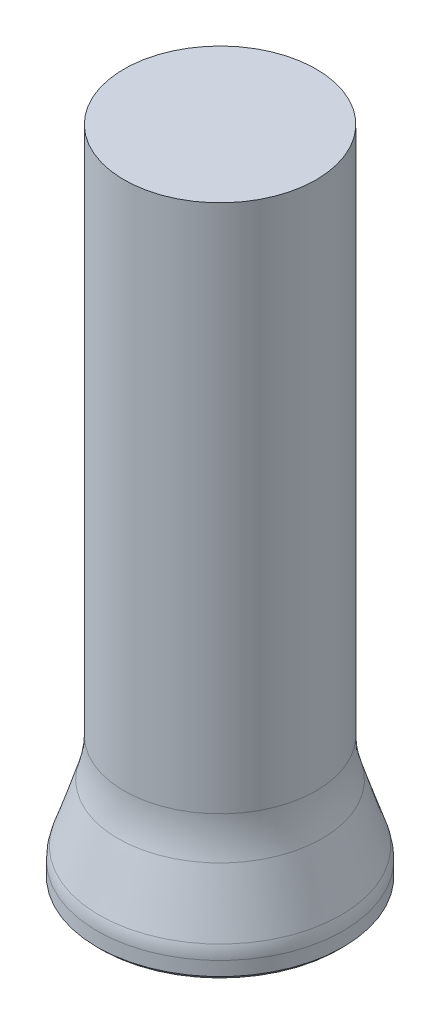
ISO-10303-21;
HEADER;
FILE_DESCRIPTION(('STEP AP214'),'2;1');
FILE_NAME('part.step','',(''),(''),'','','');
FILE_SCHEMA(('AUTOMOTIVE_DESIGN { 1 0 10303 214 1 1 1 1 }'));
ENDSEC;
DATA;
#1=APPLICATION_CONTEXT('core data for automotive mechanical design processes');
#2=APPLICATION_PROTOCOL_DEFINITION('international standard','automotive_design',2000,#1);
#3=PRODUCT_CONTEXT('',#1,'mechanical');
#4=PRODUCT('Part','Part','',(#3));
#5=PRODUCT_RELATED_PRODUCT_CATEGORY('part','',(#4));
#6=PRODUCT_DEFINITION_FORMATION('','',#4);
#7=PRODUCT_DEFINITION_CONTEXT('part definition',#1,'design');
#8=PRODUCT_DEFINITION('design','',#6,#7);
#9=PRODUCT_DEFINITION_SHAPE('','',#8);
#10=(LENGTH_UNIT() NAMED_UNIT(*) SI_UNIT(.MILLI.,.METRE.));
#11=(NAMED_UNIT(*) PLANE_ANGLE_UNIT() SI_UNIT($,.RADIAN.));
#12=(NAMED_UNIT(*) SI_UNIT($,.STERADIAN.) SOLID_ANGLE_UNIT());
#13=UNCERTAINTY_MEASURE_WITH_UNIT(LENGTH_MEASURE(1.E-05),#10,'distance_accuracy_value','');
#14=(GEOMETRIC_REPRESENTATION_CONTEXT(3) GLOBAL_UNCERTAINTY_ASSIGNED_CONTEXT((#13)) GLOBAL_UNIT_ASSIGNED_CONTEXT((#10,
#11,#12)) REPRESENTATION_CONTEXT('',''));
#15=CARTESIAN_POINT('',(0.,0.,0.));
#16=DIRECTION('',(0.,0.,1.));
#17=DIRECTION('',(1.,0.,0.));
#18=AXIS2_PLACEMENT_3D('',#15,#16,#17);
#19=CARTESIAN_POINT('',(0.,-45.9285357737105,0.));
#20=DIRECTION('',(0.,1.,0.));
#21=DIRECTION('',(-1.,0.,0.));
#22=AXIS2_PLACEMENT_3D('',#19,#20,#21);
#23=PLANE('',#22);
#24=CARTESIAN_POINT('',(0.,-45.9285357737105,0.));
#25=DIRECTION('',(0.,-1.,0.));
#26=DIRECTION('',(1.,0.,0.));
#27=AXIS2_PLACEMENT_3D('',#24,#25,#26);
#28=CIRCLE('',#27,5.);
#29=CARTESIAN_POINT('',(5.00000000000002,-45.9285357737105,0.));
#30=VERTEX_POINT('',#29);
#31=EDGE_CURVE('E52',#30,#30,#28,.T.);
#32=ORIENTED_EDGE('',*,*,#31,.T.);
#33=EDGE_LOOP('',(#32));
#34=FACE_BOUND('',#33,.T.);
#35=ADVANCED_FACE('F32',(#34),#23,.F.);
#36=CARTESIAN_POINT('',(0.,-45.9285357737105,0.));
#37=DIRECTION('',(0.,-1.,0.));
#38=DIRECTION('',(1.,0.,0.));
#39=AXIS2_PLACEMENT_3D('',#36,#37,#38);
#40=CYLINDRICAL_SURFACE('',#39,5.);
#41=CARTESIAN_POINT('',(0.,-47.9285357737105,0.));
#42=DIRECTION('',(0.,1.,0.));
#43=DIRECTION('',(-1.,0.,0.));
#44=AXIS2_PLACEMENT_3D('',#41,#42,#43);
#45=CIRCLE('',#44,5.);
#46=CARTESIAN_POINT('',(-4.99999999999998,-47.9285357737105,0.));
#47=VERTEX_POINT('',#46);
#48=EDGE_CURVE('E10',#47,#47,#45,.F.);
#49=ORIENTED_EDGE('',*,*,#48,.T.);
#50=EDGE_LOOP('',(#49));
#51=FACE_BOUND('',#50,.T.);
#52=ORIENTED_EDGE('',*,*,#31,.F.);
#53=EDGE_LOOP('',(#52));
#54=FACE_BOUND('',#53,.T.);
#55=ADVANCED_FACE('F86',(#51,#54),#40,.F.);
#56=CARTESIAN_POINT('',(-30.,-48.9285357737105,0.));
#57=DIRECTION('',(0.,1.,0.));
#58=DIRECTION('',(-1.,0.,0.));
#59=AXIS2_PLACEMENT_3D('',#56,#57,#58);
#60=PLANE('',#59);
#61=CARTESIAN_POINT('',(0.,-48.9285357737105,0.));
#62=DIRECTION('',(0.,1.,0.));
#63=DIRECTION('',(-1.,0.,0.));
#64=AXIS2_PLACEMENT_3D('',#61,#62,#63);
#65=CIRCLE('',#64,29.);
#66=CARTESIAN_POINT('',(-29.,-48.9285357737105,0.));
#67=VERTEX_POINT('',#66);
#68=EDGE_CURVE('E43',#67,#67,#65,.F.);
#69=ORIENTED_EDGE('',*,*,#68,.T.);
#70=EDGE_LOOP('',(#69));
#71=FACE_BOUND('',#70,.T.);
#72=CARTESIAN_POINT('',(0.,-48.9285357737105,0.));
#73=DIRECTION('',(0.,1.,0.));
#74=DIRECTION('',(-1.,0.,0.));
#75=AXIS2_PLACEMENT_3D('',#72,#73,#74);
#76=CIRCLE('',#75,6.00000000000001);
#77=CARTESIAN_POINT('',(-5.99999999999999,-48.9285357737105,0.));
#78=VERTEX_POINT('',#77);
#79=EDGE_CURVE('E47',#78,#78,#76,.T.);
#80=ORIENTED_EDGE('',*,*,#79,.T.);
#81=EDGE_LOOP('',(#80));
#82=FACE_BOUND('',#81,.T.);
#83=ADVANCED_FACE('F92',(#71,#82),#60,.F.);
#84=CARTESIAN_POINT('',(0.,-45.9285357737105,0.));
#85=DIRECTION('',(0.,-1.,0.));
#86=DIRECTION('',(1.,0.,0.));
#87=AXIS2_PLACEMENT_3D('',#84,#85,#86);
#88=CYLINDRICAL_SURFACE('',#87,30.);
#89=CARTESIAN_POINT('',(0.,-47.9285357737105,0.));
#90=DIRECTION('',(0.,1.,0.));
#91=DIRECTION('',(-1.,0.,0.));
#92=AXIS2_PLACEMENT_3D('',#89,#90,#91);
#93=CIRCLE('',#92,30.);
#94=CARTESIAN_POINT('',(-30.,-47.9285357737105,0.));
#95=VERTEX_POINT('',#94);
#96=EDGE_CURVE('E39',#95,#95,#93,.T.);
#97=ORIENTED_EDGE('',*,*,#96,.T.);
#98=EDGE_LOOP('',(#97));
#99=FACE_BOUND('',#98,.T.);
#100=CARTESIAN_POINT('',(0.,-44.5243355752286,0.));
#101=DIRECTION('',(0.,-1.,0.));
#102=DIRECTION('',(1.,0.,0.));
#103=AXIS2_PLACEMENT_3D('',#100,#101,#102);
#104=CIRCLE('',#103,30.);
#105=CARTESIAN_POINT('',(30.,-44.5243355752286,0.));
#106=VERTEX_POINT('',#105);
#107=EDGE_CURVE('E55',#106,#106,#104,.T.);
#108=ORIENTED_EDGE('',*,*,#107,.T.);
#109=EDGE_LOOP('',(#108));
#110=FACE_BOUND('',#109,.T.);
#111=ADVANCED_FACE('F97',(#99,#110),#88,.T.);
#112=CARTESIAN_POINT('',(0.,-44.5243355752286,0.));
#113=DIRECTION('',(0.,-1.,0.));
#114=DIRECTION('',(1.,0.,0.));
#115=AXIS2_PLACEMENT_3D('',#112,#113,#114);
#116=TOROIDAL_SURFACE('',#115,20.,10.);
#117=ORIENTED_EDGE('',*,*,#107,.F.);
#118=EDGE_LOOP('',(#117));
#119=FACE_BOUND('',#118,.T.);
#120=CARTESIAN_POINT('',(0.,-41.4119941434583,0.));
#121=DIRECTION('',(0.,-1.,0.));
#122=DIRECTION('',(1.,0.,0.));
#123=AXIS2_PLACEMENT_3D('',#120,#121,#122);
#124=CIRCLE('',#123,29.5033326160924);
#125=CARTESIAN_POINT('',(29.5033326160924,-41.4119941434583,0.));
#126=VERTEX_POINT('',#125);
#127=EDGE_CURVE('E58',#126,#126,#124,.T.);
#128=ORIENTED_EDGE('',*,*,#127,.T.);
#129=EDGE_LOOP('',(#128));
#130=FACE_BOUND('',#129,.T.);
#131=ADVANCED_FACE('F101',(#119,#130),#116,.T.);
#132=CARTESIAN_POINT('',(0.,-27.4781606644669,0.));
#133=DIRECTION('',(0.,-1.,0.));
#134=DIRECTION('',(1.,0.,0.));
#135=AXIS2_PLACEMENT_3D('',#132,#133,#134);
#136=CONICAL_SURFACE('',#135,24.9400021517227,0.316491399278022);
#137=ORIENTED_EDGE('',*,*,#127,.F.);
#138=EDGE_LOOP('',(#137));
#139=FACE_BOUND('',#138,.T.);
#140=CARTESIAN_POINT('',(0.,-27.4781606644669,0.));
#141=DIRECTION('',(0.,-1.,0.));
#142=DIRECTION('',(1.,0.,0.));
#143=AXIS2_PLACEMENT_3D('',#140,#141,#142);
#144=CIRCLE('',#143,24.9400021517227);
#145=CARTESIAN_POINT('',(24.9400021517227,-27.4781606644669,0.));
#146=VERTEX_POINT('',#145);
#147=EDGE_CURVE('E61',#146,#146,#144,.T.);
#148=ORIENTED_EDGE('',*,*,#147,.T.);
#149=EDGE_LOOP('',(#148));
#150=FACE_BOUND('',#149,.T.);
#151=ADVANCED_FACE('F104',(#139,#150),#136,.T.);
#152=CARTESIAN_POINT('',(0.,-18.141136369156,0.));
#153=DIRECTION('',(0.,-1.,0.));
#154=DIRECTION('',(1.,0.,0.));
#155=AXIS2_PLACEMENT_3D('',#152,#153,#154);
#156=TOROIDAL_SURFACE('',#155,53.45,30.);
#157=ORIENTED_EDGE('',*,*,#147,.F.);
#158=EDGE_LOOP('',(#157));
#159=FACE_BOUND('',#158,.T.);
#160=CARTESIAN_POINT('',(0.,-18.1411363691559,0.));
#161=DIRECTION('',(0.,-1.,0.));
#162=DIRECTION('',(1.,0.,0.));
#163=AXIS2_PLACEMENT_3D('',#160,#161,#162);
#164=CIRCLE('',#163,23.45);
#165=CARTESIAN_POINT('',(23.45,-18.1411363691559,0.));
#166=VERTEX_POINT('',#165);
#167=EDGE_CURVE('E64',#166,#166,#164,.T.);
#168=ORIENTED_EDGE('',*,*,#167,.T.);
#169=EDGE_LOOP('',(#168));
#170=FACE_BOUND('',#169,.T.);
#171=ADVANCED_FACE('F82',(#159,#170),#156,.F.);
#172=CARTESIAN_POINT('',(0.,-45.9285357737105,0.));
#173=DIRECTION('',(0.,-1.,0.));
#174=DIRECTION('',(1.,0.,0.));
#175=AXIS2_PLACEMENT_3D('',#172,#173,#174);
#176=CYLINDRICAL_SURFACE('',#175,23.45);
#177=ORIENTED_EDGE('',*,*,#167,.F.);
#178=EDGE_LOOP('',(#177));
#179=FACE_BOUND('',#178,.T.);
#180=CARTESIAN_POINT('',(0.,111.07146422629,0.));
#181=DIRECTION('',(0.,-1.,0.));
#182=DIRECTION('',(1.,0.,0.));
#183=AXIS2_PLACEMENT_3D('',#180,#181,#182);
#184=CIRCLE('',#183,23.45);
#185=CARTESIAN_POINT('',(23.45,111.07146422629,0.));
#186=VERTEX_POINT('',#185);
#187=EDGE_CURVE('E67',#186,#186,#184,.T.);
#188=ORIENTED_EDGE('',*,*,#187,.T.);
#189=EDGE_LOOP('',(#188));
#190=FACE_BOUND('',#189,.T.);
#191=ADVANCED_FACE('F71',(#179,#190),#176,.T.);
#192=CARTESIAN_POINT('',(0.,111.07146422629,0.));
#193=DIRECTION('',(0.,-1.,0.));
#194=DIRECTION('',(1.,0.,0.));
#195=AXIS2_PLACEMENT_3D('',#192,#193,#194);
#196=PLANE('',#195);
#197=ORIENTED_EDGE('',*,*,#187,.F.);
#198=EDGE_LOOP('',(#197));
#199=FACE_BOUND('',#198,.T.);
#200=ADVANCED_FACE('F73',(#199),#196,.F.);
#201=CARTESIAN_POINT('',(0.,-48.9285357737105,0.));
#202=DIRECTION('',(0.,1.,0.));
#203=DIRECTION('',(-1.,0.,0.));
#204=AXIS2_PLACEMENT_3D('',#201,#202,#203);
#205=CONICAL_SURFACE('',#204,29.,0.785398163397438);
#206=ORIENTED_EDGE('',*,*,#96,.F.);
#207=EDGE_LOOP('',(#206));
#208=FACE_BOUND('',#207,.T.);
#209=ORIENTED_EDGE('',*,*,#68,.F.);
#210=EDGE_LOOP('',(#209));
#211=FACE_BOUND('',#210,.T.);
#212=ADVANCED_FACE('F75',(#208,#211),#205,.T.);
#213=CARTESIAN_POINT('',(0.,-47.9285357737105,0.));
#214=DIRECTION('',(0.,-1.,0.));
#215=DIRECTION('',(1.,0.,0.));
#216=AXIS2_PLACEMENT_3D('',#213,#214,#215);
#217=CONICAL_SURFACE('',#216,5.,0.785398163397444);
#218=ORIENTED_EDGE('',*,*,#79,.F.);
#219=EDGE_LOOP('',(#218));
#220=FACE_BOUND('',#219,.T.);
#221=ORIENTED_EDGE('',*,*,#48,.F.);
#222=EDGE_LOOP('',(#221));
#223=FACE_BOUND('',#222,.T.);
#224=ADVANCED_FACE('F34',(#220,#223),#217,.F.);
#225=CLOSED_SHELL('',(#35,#55,#83,#111,#131,#151,#171,#191,#200,#212,#224));
#226=MANIFOLD_SOLID_BREP('B2',#225);
#227=ADVANCED_BREP_SHAPE_REPRESENTATION('',(#18,#226),#14);
#228=SHAPE_DEFINITION_REPRESENTATION(#9,#227);
ENDSEC;
END-ISO-10303-21;
